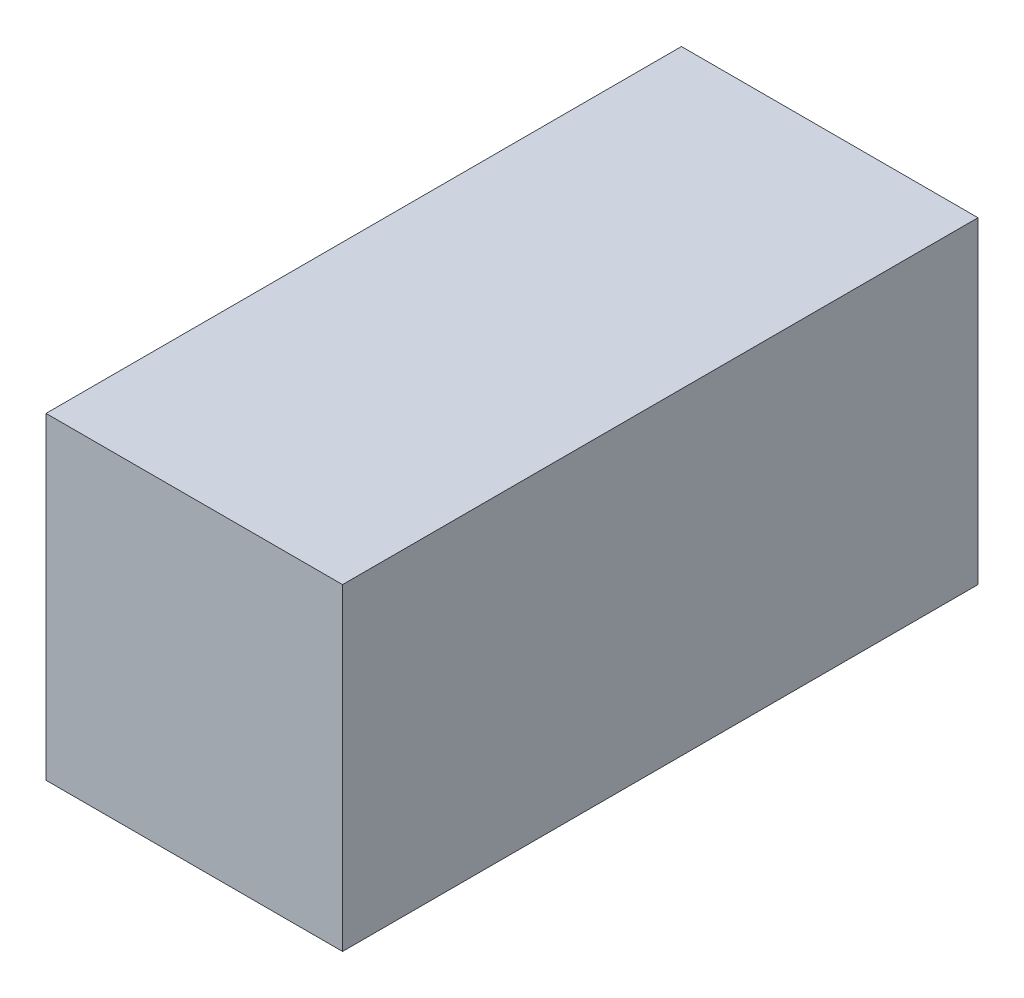
ISO-10303-21;
HEADER;
FILE_DESCRIPTION(('STEP AP214'),'2;1');
FILE_NAME('part.step','',(''),(''),'','','');
FILE_SCHEMA(('AUTOMOTIVE_DESIGN { 1 0 10303 214 1 1 1 1 }'));
ENDSEC;
DATA;
#1=APPLICATION_CONTEXT('core data for automotive mechanical design processes');
#2=APPLICATION_PROTOCOL_DEFINITION('international standard','automotive_design',2000,#1);
#3=PRODUCT_CONTEXT('',#1,'mechanical');
#4=PRODUCT('Part','Part','',(#3));
#5=PRODUCT_RELATED_PRODUCT_CATEGORY('part','',(#4));
#6=PRODUCT_DEFINITION_FORMATION('','',#4);
#7=PRODUCT_DEFINITION_CONTEXT('part definition',#1,'design');
#8=PRODUCT_DEFINITION('design','',#6,#7);
#9=PRODUCT_DEFINITION_SHAPE('','',#8);
#10=(LENGTH_UNIT() NAMED_UNIT(*) SI_UNIT(.MILLI.,.METRE.));
#11=(NAMED_UNIT(*) PLANE_ANGLE_UNIT() SI_UNIT($,.RADIAN.));
#12=(NAMED_UNIT(*) SI_UNIT($,.STERADIAN.) SOLID_ANGLE_UNIT());
#13=UNCERTAINTY_MEASURE_WITH_UNIT(LENGTH_MEASURE(1.E-05),#10,'distance_accuracy_value','');
#14=(GEOMETRIC_REPRESENTATION_CONTEXT(3) GLOBAL_UNCERTAINTY_ASSIGNED_CONTEXT((#13)) GLOBAL_UNIT_ASSIGNED_CONTEXT((#10,
#11,#12)) REPRESENTATION_CONTEXT('',''));
#15=CARTESIAN_POINT('',(0.,0.,0.));
#16=DIRECTION('',(0.,0.,1.));
#17=DIRECTION('',(1.,0.,0.));
#18=AXIS2_PLACEMENT_3D('',#15,#16,#17);
#19=CARTESIAN_POINT('',(530.,405.,-400.));
#20=DIRECTION('',(-1.,0.,0.));
#21=DIRECTION('',(0.,0.,1.));
#22=AXIS2_PLACEMENT_3D('',#19,#20,#21);
#23=PLANE('',#22);
#24=DIRECTION('',(0.,-1.,0.));
#25=VECTOR('',#24,1.);
#26=CARTESIAN_POINT('',(530.,405.,-100.));
#27=LINE('',#26,#25);
#28=CARTESIAN_POINT('',(530.,555.,-100.));
#29=VERTEX_POINT('',#28);
#30=CARTESIAN_POINT('',(530.,405.,-100.));
#31=VERTEX_POINT('',#30);
#32=EDGE_CURVE('E103',#29,#31,#27,.T.);
#33=ORIENTED_EDGE('',*,*,#32,.F.);
#34=DIRECTION('',(0.,0.,1.));
#35=VECTOR('',#34,1.);
#36=CARTESIAN_POINT('',(530.,555.,-400.));
#37=LINE('',#36,#35);
#38=CARTESIAN_POINT('',(530.,555.,-400.));
#39=VERTEX_POINT('',#38);
#40=EDGE_CURVE('E11',#39,#29,#37,.T.);
#41=ORIENTED_EDGE('',*,*,#40,.F.);
#42=DIRECTION('',(0.,-1.,0.));
#43=VECTOR('',#42,1.);
#44=CARTESIAN_POINT('',(530.,405.,-400.));
#45=LINE('',#44,#43);
#46=CARTESIAN_POINT('',(530.,405.,-400.));
#47=VERTEX_POINT('',#46);
#48=EDGE_CURVE('E97',#39,#47,#45,.T.);
#49=ORIENTED_EDGE('',*,*,#48,.T.);
#50=DIRECTION('',(0.,0.,1.));
#51=VECTOR('',#50,1.);
#52=CARTESIAN_POINT('',(530.,405.,-400.));
#53=LINE('',#52,#51);
#54=EDGE_CURVE('E42',#47,#31,#53,.T.);
#55=ORIENTED_EDGE('',*,*,#54,.T.);
#56=EDGE_LOOP('',(#33,#41,#49,#55));
#57=FACE_BOUND('',#56,.T.);
#58=ADVANCED_FACE('F39',(#57),#23,.T.);
#59=CARTESIAN_POINT('',(530.,555.,-400.));
#60=DIRECTION('',(0.,1.,0.));
#61=DIRECTION('',(0.,0.,1.));
#62=AXIS2_PLACEMENT_3D('',#59,#60,#61);
#63=PLANE('',#62);
#64=DIRECTION('',(-1.,0.,0.));
#65=VECTOR('',#64,1.);
#66=CARTESIAN_POINT('',(530.,555.,-100.));
#67=LINE('',#66,#65);
#68=CARTESIAN_POINT('',(670.,555.,-100.));
#69=VERTEX_POINT('',#68);
#70=EDGE_CURVE('E99',#69,#29,#67,.T.);
#71=ORIENTED_EDGE('',*,*,#70,.F.);
#72=DIRECTION('',(0.,0.,1.));
#73=VECTOR('',#72,1.);
#74=CARTESIAN_POINT('',(670.,555.,-400.));
#75=LINE('',#74,#73);
#76=CARTESIAN_POINT('',(670.,555.,-400.));
#77=VERTEX_POINT('',#76);
#78=EDGE_CURVE('E48',#77,#69,#75,.T.);
#79=ORIENTED_EDGE('',*,*,#78,.F.);
#80=DIRECTION('',(-1.,0.,0.));
#81=VECTOR('',#80,1.);
#82=CARTESIAN_POINT('',(530.,555.,-400.));
#83=LINE('',#82,#81);
#84=EDGE_CURVE('E94',#77,#39,#83,.T.);
#85=ORIENTED_EDGE('',*,*,#84,.T.);
#86=ORIENTED_EDGE('',*,*,#40,.T.);
#87=EDGE_LOOP('',(#71,#79,#85,#86));
#88=FACE_BOUND('',#87,.T.);
#89=ADVANCED_FACE('F113',(#88),#63,.T.);
#90=CARTESIAN_POINT('',(670.,405.,-400.));
#91=DIRECTION('',(1.,0.,0.));
#92=DIRECTION('',(0.,0.,-1.));
#93=AXIS2_PLACEMENT_3D('',#90,#91,#92);
#94=PLANE('',#93);
#95=DIRECTION('',(0.,1.,0.));
#96=VECTOR('',#95,1.);
#97=CARTESIAN_POINT('',(670.,405.,-100.));
#98=LINE('',#97,#96);
#99=CARTESIAN_POINT('',(670.,405.,-100.));
#100=VERTEX_POINT('',#99);
#101=EDGE_CURVE('E89',#100,#69,#98,.T.);
#102=ORIENTED_EDGE('',*,*,#101,.F.);
#103=DIRECTION('',(0.,0.,1.));
#104=VECTOR('',#103,1.);
#105=CARTESIAN_POINT('',(670.,405.,-400.));
#106=LINE('',#105,#104);
#107=CARTESIAN_POINT('',(670.,405.,-400.));
#108=VERTEX_POINT('',#107);
#109=EDGE_CURVE('E84',#108,#100,#106,.T.);
#110=ORIENTED_EDGE('',*,*,#109,.F.);
#111=DIRECTION('',(0.,1.,0.));
#112=VECTOR('',#111,1.);
#113=CARTESIAN_POINT('',(670.,405.,-400.));
#114=LINE('',#113,#112);
#115=EDGE_CURVE('E87',#108,#77,#114,.T.);
#116=ORIENTED_EDGE('',*,*,#115,.T.);
#117=ORIENTED_EDGE('',*,*,#78,.T.);
#118=EDGE_LOOP('',(#102,#110,#116,#117));
#119=FACE_BOUND('',#118,.T.);
#120=ADVANCED_FACE('F86',(#119),#94,.T.);
#121=CARTESIAN_POINT('',(530.,405.,-400.));
#122=DIRECTION('',(0.,-1.,0.));
#123=DIRECTION('',(0.,0.,-1.));
#124=AXIS2_PLACEMENT_3D('',#121,#122,#123);
#125=PLANE('',#124);
#126=DIRECTION('',(1.,0.,0.));
#127=VECTOR('',#126,1.);
#128=CARTESIAN_POINT('',(530.,405.,-100.));
#129=LINE('',#128,#127);
#130=EDGE_CURVE('E106',#31,#100,#129,.T.);
#131=ORIENTED_EDGE('',*,*,#130,.F.);
#132=ORIENTED_EDGE('',*,*,#54,.F.);
#133=DIRECTION('',(1.,0.,0.));
#134=VECTOR('',#133,1.);
#135=CARTESIAN_POINT('',(530.,405.,-400.));
#136=LINE('',#135,#134);
#137=EDGE_CURVE('E93',#47,#108,#136,.T.);
#138=ORIENTED_EDGE('',*,*,#137,.T.);
#139=ORIENTED_EDGE('',*,*,#109,.T.);
#140=EDGE_LOOP('',(#131,#132,#138,#139));
#141=FACE_BOUND('',#140,.T.);
#142=ADVANCED_FACE('F96',(#141),#125,.T.);
#143=CARTESIAN_POINT('',(0.,0.,-400.));
#144=DIRECTION('',(0.,0.,-1.));
#145=DIRECTION('',(-1.,0.,0.));
#146=AXIS2_PLACEMENT_3D('',#143,#144,#145);
#147=PLANE('',#146);
#148=ORIENTED_EDGE('',*,*,#48,.F.);
#149=ORIENTED_EDGE('',*,*,#84,.F.);
#150=ORIENTED_EDGE('',*,*,#115,.F.);
#151=ORIENTED_EDGE('',*,*,#137,.F.);
#152=EDGE_LOOP('',(#148,#149,#150,#151));
#153=FACE_BOUND('',#152,.T.);
#154=ADVANCED_FACE('F92',(#153),#147,.T.);
#155=CARTESIAN_POINT('',(0.,0.,-100.));
#156=DIRECTION('',(0.,0.,-1.));
#157=DIRECTION('',(-1.,0.,0.));
#158=AXIS2_PLACEMENT_3D('',#155,#156,#157);
#159=PLANE('',#158);
#160=ORIENTED_EDGE('',*,*,#32,.T.);
#161=ORIENTED_EDGE('',*,*,#130,.T.);
#162=ORIENTED_EDGE('',*,*,#101,.T.);
#163=ORIENTED_EDGE('',*,*,#70,.T.);
#164=EDGE_LOOP('',(#160,#161,#162,#163));
#165=FACE_BOUND('',#164,.T.);
#166=ADVANCED_FACE('F112',(#165),#159,.F.);
#167=CLOSED_SHELL('',(#58,#89,#120,#142,#154,#166));
#168=MANIFOLD_SOLID_BREP('B2',#167);
#169=ADVANCED_BREP_SHAPE_REPRESENTATION('',(#18,#168),#14);
#170=SHAPE_DEFINITION_REPRESENTATION(#9,#169);
ENDSEC;
END-ISO-10303-21;
